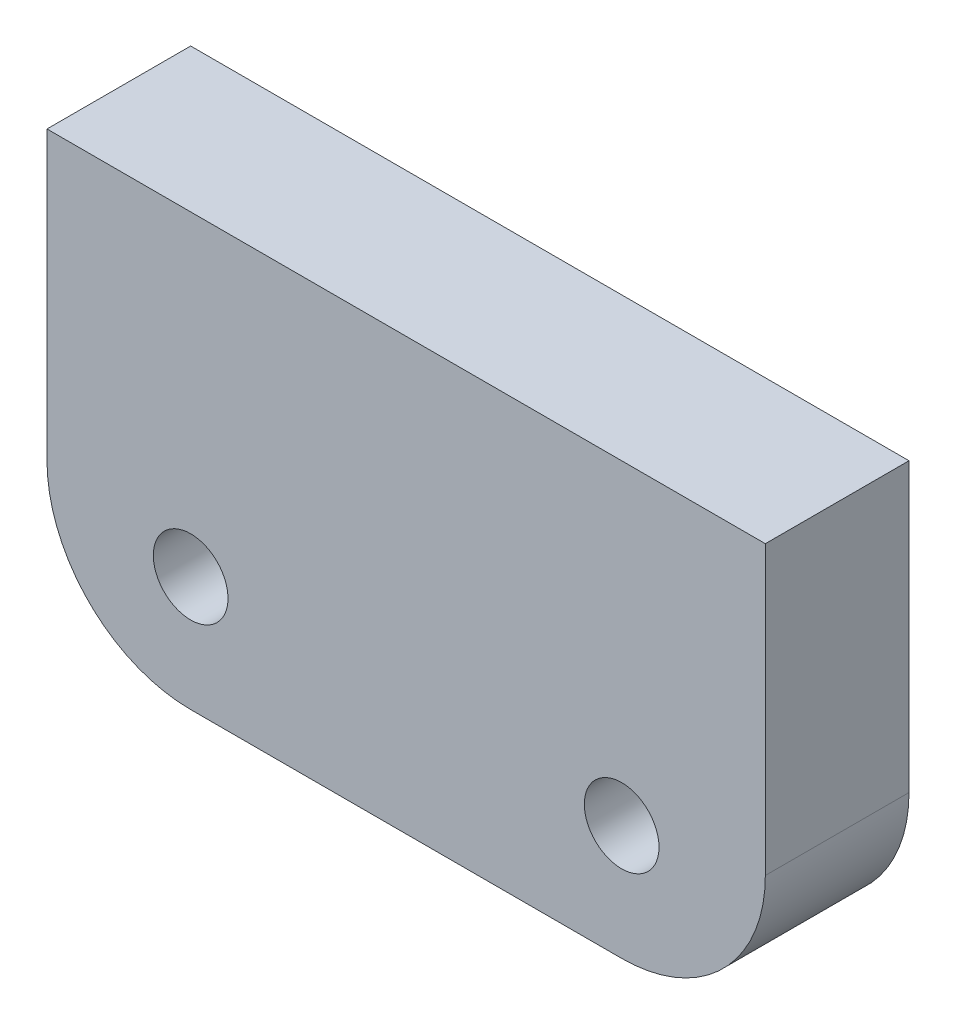
ISO-10303-21;
HEADER;
FILE_DESCRIPTION(('STEP AP214'),'2;1');
FILE_NAME('part.step','',(''),(''),'','','');
FILE_SCHEMA(('AUTOMOTIVE_DESIGN { 1 0 10303 214 1 1 1 1 }'));
ENDSEC;
DATA;
#1=APPLICATION_CONTEXT('core data for automotive mechanical design processes');
#2=APPLICATION_PROTOCOL_DEFINITION('international standard','automotive_design',2000,#1);
#3=PRODUCT_CONTEXT('',#1,'mechanical');
#4=PRODUCT('Part','Part','',(#3));
#5=PRODUCT_RELATED_PRODUCT_CATEGORY('part','',(#4));
#6=PRODUCT_DEFINITION_FORMATION('','',#4);
#7=PRODUCT_DEFINITION_CONTEXT('part definition',#1,'design');
#8=PRODUCT_DEFINITION('design','',#6,#7);
#9=PRODUCT_DEFINITION_SHAPE('','',#8);
#10=(LENGTH_UNIT() NAMED_UNIT(*) SI_UNIT(.MILLI.,.METRE.));
#11=(NAMED_UNIT(*) PLANE_ANGLE_UNIT() SI_UNIT($,.RADIAN.));
#12=(NAMED_UNIT(*) SI_UNIT($,.STERADIAN.) SOLID_ANGLE_UNIT());
#13=UNCERTAINTY_MEASURE_WITH_UNIT(LENGTH_MEASURE(1.E-05),#10,'distance_accuracy_value','');
#14=(GEOMETRIC_REPRESENTATION_CONTEXT(3) GLOBAL_UNCERTAINTY_ASSIGNED_CONTEXT((#13)) GLOBAL_UNIT_ASSIGNED_CONTEXT((#10,
#11,#12)) REPRESENTATION_CONTEXT('',''));
#15=CARTESIAN_POINT('',(0.,0.,0.));
#16=DIRECTION('',(0.,0.,1.));
#17=DIRECTION('',(1.,0.,0.));
#18=AXIS2_PLACEMENT_3D('',#15,#16,#17);
#19=CARTESIAN_POINT('',(-25.,449.949674922525,10.));
#20=DIRECTION('',(1.,0.,0.));
#21=DIRECTION('',(0.,1.,0.));
#22=AXIS2_PLACEMENT_3D('',#19,#20,#21);
#23=PLANE('',#22);
#24=DIRECTION('',(0.,-1.,0.));
#25=VECTOR('',#24,1.);
#26=CARTESIAN_POINT('',(-25.,449.949674922525,0.));
#27=LINE('',#26,#25);
#28=CARTESIAN_POINT('',(-25.,449.949674922525,0.));
#29=VERTEX_POINT('',#28);
#30=CARTESIAN_POINT('',(-25.,429.949674922525,0.));
#31=VERTEX_POINT('',#30);
#32=EDGE_CURVE('E216',#29,#31,#27,.T.);
#33=ORIENTED_EDGE('',*,*,#32,.T.);
#34=DIRECTION('',(0.,0.,-1.));
#35=VECTOR('',#34,1.);
#36=CARTESIAN_POINT('',(-25.,429.949674922525,10.));
#37=LINE('',#36,#35);
#38=CARTESIAN_POINT('',(-25.,429.949674922525,10.));
#39=VERTEX_POINT('',#38);
#40=EDGE_CURVE('E56',#31,#39,#37,.F.);
#41=ORIENTED_EDGE('',*,*,#40,.T.);
#42=DIRECTION('',(0.,-1.,0.));
#43=VECTOR('',#42,1.);
#44=CARTESIAN_POINT('',(-25.,449.949674922525,10.));
#45=LINE('',#44,#43);
#46=CARTESIAN_POINT('',(-25.,449.949674922525,10.));
#47=VERTEX_POINT('',#46);
#48=EDGE_CURVE('E272',#47,#39,#45,.T.);
#49=ORIENTED_EDGE('',*,*,#48,.F.);
#50=DIRECTION('',(0.,0.,-1.));
#51=VECTOR('',#50,1.);
#52=CARTESIAN_POINT('',(-25.,449.949674922525,10.));
#53=LINE('',#52,#51);
#54=EDGE_CURVE('E281',#47,#29,#53,.T.);
#55=ORIENTED_EDGE('',*,*,#54,.T.);
#56=EDGE_LOOP('',(#33,#41,#49,#55));
#57=FACE_BOUND('',#56,.T.);
#58=ADVANCED_FACE('F33',(#57),#23,.F.);
#59=CARTESIAN_POINT('',(-25.,419.949674922525,10.));
#60=DIRECTION('',(0.,1.,0.));
#61=DIRECTION('',(0.,0.,1.));
#62=AXIS2_PLACEMENT_3D('',#59,#60,#61);
#63=PLANE('',#62);
#64=DIRECTION('',(1.,0.,0.));
#65=VECTOR('',#64,1.);
#66=CARTESIAN_POINT('',(-25.,419.949674922525,10.));
#67=LINE('',#66,#65);
#68=CARTESIAN_POINT('',(-15.,419.949674922525,10.));
#69=VERTEX_POINT('',#68);
#70=CARTESIAN_POINT('',(15.,419.949674922525,10.));
#71=VERTEX_POINT('',#70);
#72=EDGE_CURVE('E274',#69,#71,#67,.T.);
#73=ORIENTED_EDGE('',*,*,#72,.F.);
#74=DIRECTION('',(0.,0.,-1.));
#75=VECTOR('',#74,1.);
#76=CARTESIAN_POINT('',(-15.,419.949674922525,10.));
#77=LINE('',#76,#75);
#78=CARTESIAN_POINT('',(-15.,419.949674922525,0.));
#79=VERTEX_POINT('',#78);
#80=EDGE_CURVE('E296',#69,#79,#77,.T.);
#81=ORIENTED_EDGE('',*,*,#80,.T.);
#82=DIRECTION('',(1.,0.,0.));
#83=VECTOR('',#82,1.);
#84=CARTESIAN_POINT('',(-25.,419.949674922525,0.));
#85=LINE('',#84,#83);
#86=CARTESIAN_POINT('',(15.,419.949674922525,0.));
#87=VERTEX_POINT('',#86);
#88=EDGE_CURVE('E283',#79,#87,#85,.T.);
#89=ORIENTED_EDGE('',*,*,#88,.T.);
#90=DIRECTION('',(0.,0.,-1.));
#91=VECTOR('',#90,1.);
#92=CARTESIAN_POINT('',(15.,419.949674922525,10.));
#93=LINE('',#92,#91);
#94=EDGE_CURVE('E294',#87,#71,#93,.F.);
#95=ORIENTED_EDGE('',*,*,#94,.T.);
#96=EDGE_LOOP('',(#73,#81,#89,#95));
#97=FACE_BOUND('',#96,.T.);
#98=ADVANCED_FACE('F310',(#97),#63,.F.);
#99=CARTESIAN_POINT('',(25.,449.949674922525,10.));
#100=DIRECTION('',(-1.,0.,0.));
#101=DIRECTION('',(0.,-1.,0.));
#102=AXIS2_PLACEMENT_3D('',#99,#100,#101);
#103=PLANE('',#102);
#104=DIRECTION('',(0.,1.,0.));
#105=VECTOR('',#104,1.);
#106=CARTESIAN_POINT('',(25.,449.949674922525,10.));
#107=LINE('',#106,#105);
#108=CARTESIAN_POINT('',(25.,429.949674922525,10.));
#109=VERTEX_POINT('',#108);
#110=CARTESIAN_POINT('',(25.,449.949674922525,10.));
#111=VERTEX_POINT('',#110);
#112=EDGE_CURVE('E277',#109,#111,#107,.T.);
#113=ORIENTED_EDGE('',*,*,#112,.F.);
#114=DIRECTION('',(0.,0.,-1.));
#115=VECTOR('',#114,1.);
#116=CARTESIAN_POINT('',(25.,429.949674922525,10.));
#117=LINE('',#116,#115);
#118=CARTESIAN_POINT('',(25.,429.949674922525,0.));
#119=VERTEX_POINT('',#118);
#120=EDGE_CURVE('E11',#109,#119,#117,.T.);
#121=ORIENTED_EDGE('',*,*,#120,.T.);
#122=DIRECTION('',(0.,1.,0.));
#123=VECTOR('',#122,1.);
#124=CARTESIAN_POINT('',(25.,449.949674922525,0.));
#125=LINE('',#124,#123);
#126=CARTESIAN_POINT('',(25.,449.949674922525,0.));
#127=VERTEX_POINT('',#126);
#128=EDGE_CURVE('E286',#119,#127,#125,.T.);
#129=ORIENTED_EDGE('',*,*,#128,.T.);
#130=DIRECTION('',(0.,0.,-1.));
#131=VECTOR('',#130,1.);
#132=CARTESIAN_POINT('',(25.,449.949674922525,10.));
#133=LINE('',#132,#131);
#134=EDGE_CURVE('E291',#111,#127,#133,.T.);
#135=ORIENTED_EDGE('',*,*,#134,.F.);
#136=EDGE_LOOP('',(#113,#121,#129,#135));
#137=FACE_BOUND('',#136,.T.);
#138=ADVANCED_FACE('F325',(#137),#103,.F.);
#139=CARTESIAN_POINT('',(-25.,449.949674922525,10.));
#140=DIRECTION('',(0.,-1.,0.));
#141=DIRECTION('',(0.,0.,-1.));
#142=AXIS2_PLACEMENT_3D('',#139,#140,#141);
#143=PLANE('',#142);
#144=DIRECTION('',(-1.,0.,0.));
#145=VECTOR('',#144,1.);
#146=CARTESIAN_POINT('',(-25.,449.949674922525,0.));
#147=LINE('',#146,#145);
#148=EDGE_CURVE('E275',#127,#29,#147,.T.);
#149=ORIENTED_EDGE('',*,*,#148,.T.);
#150=ORIENTED_EDGE('',*,*,#54,.F.);
#151=DIRECTION('',(-1.,0.,0.));
#152=VECTOR('',#151,1.);
#153=CARTESIAN_POINT('',(-25.,449.949674922525,10.));
#154=LINE('',#153,#152);
#155=EDGE_CURVE('E279',#111,#47,#154,.T.);
#156=ORIENTED_EDGE('',*,*,#155,.F.);
#157=ORIENTED_EDGE('',*,*,#134,.T.);
#158=EDGE_LOOP('',(#149,#150,#156,#157));
#159=FACE_BOUND('',#158,.T.);
#160=ADVANCED_FACE('F321',(#159),#143,.F.);
#161=CARTESIAN_POINT('',(0.,0.,10.));
#162=DIRECTION('',(0.,0.,1.));
#163=DIRECTION('',(1.,0.,0.));
#164=AXIS2_PLACEMENT_3D('',#161,#162,#163);
#165=PLANE('',#164);
#166=CARTESIAN_POINT('',(-15.,427.949674922525,10.));
#167=DIRECTION('',(0.,0.,-1.));
#168=DIRECTION('',(-1.,0.,0.));
#169=AXIS2_PLACEMENT_3D('',#166,#167,#168);
#170=CIRCLE('',#169,2.6);
#171=CARTESIAN_POINT('',(-17.6,427.949674922525,10.));
#172=VERTEX_POINT('',#171);
#173=EDGE_CURVE('E247',#172,#172,#170,.T.);
#174=ORIENTED_EDGE('',*,*,#173,.T.);
#175=EDGE_LOOP('',(#174));
#176=FACE_BOUND('',#175,.T.);
#177=CARTESIAN_POINT('',(15.,427.949674922525,10.));
#178=DIRECTION('',(0.,0.,-1.));
#179=DIRECTION('',(1.,0.,0.));
#180=AXIS2_PLACEMENT_3D('',#177,#178,#179);
#181=CIRCLE('',#180,2.6);
#182=CARTESIAN_POINT('',(17.6,427.949674922525,10.));
#183=VERTEX_POINT('',#182);
#184=EDGE_CURVE('E415',#183,#183,#181,.T.);
#185=ORIENTED_EDGE('',*,*,#184,.T.);
#186=EDGE_LOOP('',(#185));
#187=FACE_BOUND('',#186,.T.);
#188=ORIENTED_EDGE('',*,*,#48,.T.);
#189=CARTESIAN_POINT('',(-15.,429.949674922525,10.));
#190=DIRECTION('',(0.,0.,1.));
#191=DIRECTION('',(1.,0.,0.));
#192=AXIS2_PLACEMENT_3D('',#189,#190,#191);
#193=CIRCLE('',#192,10.);
#194=EDGE_CURVE('E41',#39,#69,#193,.T.);
#195=ORIENTED_EDGE('',*,*,#194,.T.);
#196=ORIENTED_EDGE('',*,*,#72,.T.);
#197=CARTESIAN_POINT('',(15.,429.949674922525,10.));
#198=DIRECTION('',(0.,0.,1.));
#199=DIRECTION('',(1.,0.,0.));
#200=AXIS2_PLACEMENT_3D('',#197,#198,#199);
#201=CIRCLE('',#200,10.);
#202=EDGE_CURVE('E48',#71,#109,#201,.T.);
#203=ORIENTED_EDGE('',*,*,#202,.T.);
#204=ORIENTED_EDGE('',*,*,#112,.T.);
#205=ORIENTED_EDGE('',*,*,#155,.T.);
#206=EDGE_LOOP('',(#188,#195,#196,#203,#204,#205));
#207=FACE_BOUND('',#206,.T.);
#208=ADVANCED_FACE('F306',(#176,#187,#207),#165,.T.);
#209=CARTESIAN_POINT('',(0.,0.,0.));
#210=DIRECTION('',(0.,0.,1.));
#211=DIRECTION('',(1.,0.,0.));
#212=AXIS2_PLACEMENT_3D('',#209,#210,#211);
#213=PLANE('',#212);
#214=DIRECTION('',(0.866025403784437,-0.500000000000003,0.));
#215=VECTOR('',#214,1.);
#216=CARTESIAN_POINT('',(15.,432.568477076042,0.));
#217=LINE('',#216,#215);
#218=CARTESIAN_POINT('',(15.,432.568477076042,0.));
#219=VERTEX_POINT('',#218);
#220=CARTESIAN_POINT('',(19.,430.259075999284,0.));
#221=VERTEX_POINT('',#220);
#222=EDGE_CURVE('E203',#219,#221,#217,.T.);
#223=ORIENTED_EDGE('',*,*,#222,.F.);
#224=DIRECTION('',(0.86602540378444,0.499999999999997,0.));
#225=VECTOR('',#224,1.);
#226=CARTESIAN_POINT('',(11.,430.259075999284,0.));
#227=LINE('',#226,#225);
#228=CARTESIAN_POINT('',(11.,430.259075999284,0.));
#229=VERTEX_POINT('',#228);
#230=EDGE_CURVE('E168',#229,#219,#227,.T.);
#231=ORIENTED_EDGE('',*,*,#230,.F.);
#232=DIRECTION('',(0.,1.,0.));
#233=VECTOR('',#232,1.);
#234=CARTESIAN_POINT('',(11.,425.640273845767,0.));
#235=LINE('',#234,#233);
#236=CARTESIAN_POINT('',(11.,425.640273845767,0.));
#237=VERTEX_POINT('',#236);
#238=EDGE_CURVE('E186',#237,#229,#235,.T.);
#239=ORIENTED_EDGE('',*,*,#238,.F.);
#240=DIRECTION('',(-0.866025403784438,0.500000000000002,0.));
#241=VECTOR('',#240,1.);
#242=CARTESIAN_POINT('',(15.,423.330872769008,0.));
#243=LINE('',#242,#241);
#244=CARTESIAN_POINT('',(15.,423.330872769008,0.));
#245=VERTEX_POINT('',#244);
#246=EDGE_CURVE('E189',#245,#237,#243,.T.);
#247=ORIENTED_EDGE('',*,*,#246,.F.);
#248=DIRECTION('',(-0.866025403784439,-0.499999999999999,0.));
#249=VECTOR('',#248,1.);
#250=CARTESIAN_POINT('',(19.,425.640273845767,0.));
#251=LINE('',#250,#249);
#252=CARTESIAN_POINT('',(19.,425.640273845767,0.));
#253=VERTEX_POINT('',#252);
#254=EDGE_CURVE('E209',#253,#245,#251,.T.);
#255=ORIENTED_EDGE('',*,*,#254,.F.);
#256=DIRECTION('',(0.,-1.,0.));
#257=VECTOR('',#256,1.);
#258=CARTESIAN_POINT('',(19.,430.259075999284,0.));
#259=LINE('',#258,#257);
#260=EDGE_CURVE('E206',#221,#253,#259,.T.);
#261=ORIENTED_EDGE('',*,*,#260,.F.);
#262=EDGE_LOOP('',(#223,#231,#239,#247,#255,#261));
#263=FACE_BOUND('',#262,.T.);
#264=DIRECTION('',(-0.866025403784438,-0.500000000000002,0.));
#265=VECTOR('',#264,1.);
#266=CARTESIAN_POINT('',(-15.,423.330872769008,0.));
#267=LINE('',#266,#265);
#268=CARTESIAN_POINT('',(-11.,425.640273845767,0.));
#269=VERTEX_POINT('',#268);
#270=CARTESIAN_POINT('',(-15.,423.330872769008,0.));
#271=VERTEX_POINT('',#270);
#272=EDGE_CURVE('E246',#269,#271,#267,.T.);
#273=ORIENTED_EDGE('',*,*,#272,.F.);
#274=DIRECTION('',(0.,-1.,0.));
#275=VECTOR('',#274,1.);
#276=CARTESIAN_POINT('',(-11.,425.640273845767,0.));
#277=LINE('',#276,#275);
#278=CARTESIAN_POINT('',(-11.,430.259075999284,0.));
#279=VERTEX_POINT('',#278);
#280=EDGE_CURVE('E244',#279,#269,#277,.T.);
#281=ORIENTED_EDGE('',*,*,#280,.F.);
#282=DIRECTION('',(0.86602540378444,-0.499999999999997,0.));
#283=VECTOR('',#282,1.);
#284=CARTESIAN_POINT('',(-11.,430.259075999284,0.));
#285=LINE('',#284,#283);
#286=CARTESIAN_POINT('',(-15.,432.568477076042,0.));
#287=VERTEX_POINT('',#286);
#288=EDGE_CURVE('E228',#287,#279,#285,.T.);
#289=ORIENTED_EDGE('',*,*,#288,.F.);
#290=DIRECTION('',(0.866025403784437,0.500000000000004,0.));
#291=VECTOR('',#290,1.);
#292=CARTESIAN_POINT('',(-15.,432.568477076042,0.));
#293=LINE('',#292,#291);
#294=CARTESIAN_POINT('',(-19.,430.259075999284,0.));
#295=VERTEX_POINT('',#294);
#296=EDGE_CURVE('E256',#295,#287,#293,.T.);
#297=ORIENTED_EDGE('',*,*,#296,.F.);
#298=DIRECTION('',(0.,1.,0.));
#299=VECTOR('',#298,1.);
#300=CARTESIAN_POINT('',(-19.,430.259075999284,0.));
#301=LINE('',#300,#299);
#302=CARTESIAN_POINT('',(-19.,425.640273845767,0.));
#303=VERTEX_POINT('',#302);
#304=EDGE_CURVE('E253',#303,#295,#301,.T.);
#305=ORIENTED_EDGE('',*,*,#304,.F.);
#306=DIRECTION('',(-0.866025403784439,0.499999999999999,0.));
#307=VECTOR('',#306,1.);
#308=CARTESIAN_POINT('',(-19.,425.640273845767,0.));
#309=LINE('',#308,#307);
#310=EDGE_CURVE('E250',#271,#303,#309,.T.);
#311=ORIENTED_EDGE('',*,*,#310,.F.);
#312=EDGE_LOOP('',(#273,#281,#289,#297,#305,#311));
#313=FACE_BOUND('',#312,.T.);
#314=ORIENTED_EDGE('',*,*,#88,.F.);
#315=CARTESIAN_POINT('',(-15.,429.949674922525,0.));
#316=DIRECTION('',(0.,0.,1.));
#317=DIRECTION('',(1.,0.,0.));
#318=AXIS2_PLACEMENT_3D('',#315,#316,#317);
#319=CIRCLE('',#318,10.);
#320=EDGE_CURVE('E301',#79,#31,#319,.F.);
#321=ORIENTED_EDGE('',*,*,#320,.T.);
#322=ORIENTED_EDGE('',*,*,#32,.F.);
#323=ORIENTED_EDGE('',*,*,#148,.F.);
#324=ORIENTED_EDGE('',*,*,#128,.F.);
#325=CARTESIAN_POINT('',(15.,429.949674922525,0.));
#326=DIRECTION('',(0.,0.,1.));
#327=DIRECTION('',(1.,0.,0.));
#328=AXIS2_PLACEMENT_3D('',#325,#326,#327);
#329=CIRCLE('',#328,10.);
#330=EDGE_CURVE('E299',#119,#87,#329,.F.);
#331=ORIENTED_EDGE('',*,*,#330,.T.);
#332=EDGE_LOOP('',(#314,#321,#322,#323,#324,#331));
#333=FACE_BOUND('',#332,.T.);
#334=ADVANCED_FACE('F316',(#263,#313,#333),#213,.F.);
#335=CARTESIAN_POINT('',(-11.,425.640273845767,5.));
#336=DIRECTION('',(1.,0.,0.));
#337=DIRECTION('',(0.,1.,0.));
#338=AXIS2_PLACEMENT_3D('',#335,#336,#337);
#339=PLANE('',#338);
#340=ORIENTED_EDGE('',*,*,#280,.T.);
#341=DIRECTION('',(0.,0.,-1.));
#342=VECTOR('',#341,1.);
#343=CARTESIAN_POINT('',(-11.,425.640273845767,5.));
#344=LINE('',#343,#342);
#345=CARTESIAN_POINT('',(-11.,425.640273845767,5.));
#346=VERTEX_POINT('',#345);
#347=EDGE_CURVE('E243',#346,#269,#344,.T.);
#348=ORIENTED_EDGE('',*,*,#347,.F.);
#349=DIRECTION('',(0.,-1.,0.));
#350=VECTOR('',#349,1.);
#351=CARTESIAN_POINT('',(-11.,425.640273845767,5.));
#352=LINE('',#351,#350);
#353=CARTESIAN_POINT('',(-11.,430.259075999284,5.));
#354=VERTEX_POINT('',#353);
#355=EDGE_CURVE('E224',#354,#346,#352,.T.);
#356=ORIENTED_EDGE('',*,*,#355,.F.);
#357=DIRECTION('',(0.,0.,-1.));
#358=VECTOR('',#357,1.);
#359=CARTESIAN_POINT('',(-11.,430.259075999284,5.));
#360=LINE('',#359,#358);
#361=EDGE_CURVE('E204',#354,#279,#360,.T.);
#362=ORIENTED_EDGE('',*,*,#361,.T.);
#363=EDGE_LOOP('',(#340,#348,#356,#362));
#364=FACE_BOUND('',#363,.T.);
#365=ADVANCED_FACE('F346',(#364),#339,.F.);
#366=CARTESIAN_POINT('',(-11.,430.259075999284,5.));
#367=DIRECTION('',(0.499999999999997,0.86602540378444,0.));
#368=DIRECTION('',(-0.86602540378444,0.499999999999997,0.));
#369=AXIS2_PLACEMENT_3D('',#366,#367,#368);
#370=PLANE('',#369);
#371=ORIENTED_EDGE('',*,*,#288,.T.);
#372=ORIENTED_EDGE('',*,*,#361,.F.);
#373=DIRECTION('',(0.86602540378444,-0.499999999999997,0.));
#374=VECTOR('',#373,1.);
#375=CARTESIAN_POINT('',(-11.,430.259075999284,5.));
#376=LINE('',#375,#374);
#377=CARTESIAN_POINT('',(-15.,432.568477076042,5.));
#378=VERTEX_POINT('',#377);
#379=EDGE_CURVE('E240',#378,#354,#376,.T.);
#380=ORIENTED_EDGE('',*,*,#379,.F.);
#381=DIRECTION('',(0.,0.,-1.));
#382=VECTOR('',#381,1.);
#383=CARTESIAN_POINT('',(-15.,432.568477076042,5.));
#384=LINE('',#383,#382);
#385=EDGE_CURVE('E262',#378,#287,#384,.T.);
#386=ORIENTED_EDGE('',*,*,#385,.T.);
#387=EDGE_LOOP('',(#371,#372,#380,#386));
#388=FACE_BOUND('',#387,.T.);
#389=ADVANCED_FACE('F353',(#388),#370,.F.);
#390=CARTESIAN_POINT('',(-15.,432.568477076042,5.));
#391=DIRECTION('',(-0.500000000000004,0.866025403784437,0.));
#392=DIRECTION('',(-0.866025403784437,-0.500000000000004,0.));
#393=AXIS2_PLACEMENT_3D('',#390,#391,#392);
#394=PLANE('',#393);
#395=ORIENTED_EDGE('',*,*,#296,.T.);
#396=ORIENTED_EDGE('',*,*,#385,.F.);
#397=DIRECTION('',(0.866025403784437,0.500000000000004,0.));
#398=VECTOR('',#397,1.);
#399=CARTESIAN_POINT('',(-15.,432.568477076042,5.));
#400=LINE('',#399,#398);
#401=CARTESIAN_POINT('',(-19.,430.259075999284,5.));
#402=VERTEX_POINT('',#401);
#403=EDGE_CURVE('E237',#402,#378,#400,.T.);
#404=ORIENTED_EDGE('',*,*,#403,.F.);
#405=DIRECTION('',(0.,0.,-1.));
#406=VECTOR('',#405,1.);
#407=CARTESIAN_POINT('',(-19.,430.259075999284,5.));
#408=LINE('',#407,#406);
#409=EDGE_CURVE('E264',#402,#295,#408,.T.);
#410=ORIENTED_EDGE('',*,*,#409,.T.);
#411=EDGE_LOOP('',(#395,#396,#404,#410));
#412=FACE_BOUND('',#411,.T.);
#413=ADVANCED_FACE('F367',(#412),#394,.F.);
#414=CARTESIAN_POINT('',(-19.,430.259075999284,5.));
#415=DIRECTION('',(-1.,0.,0.));
#416=DIRECTION('',(0.,0.,1.));
#417=AXIS2_PLACEMENT_3D('',#414,#415,#416);
#418=PLANE('',#417);
#419=ORIENTED_EDGE('',*,*,#304,.T.);
#420=ORIENTED_EDGE('',*,*,#409,.F.);
#421=DIRECTION('',(0.,1.,0.));
#422=VECTOR('',#421,1.);
#423=CARTESIAN_POINT('',(-19.,430.259075999284,5.));
#424=LINE('',#423,#422);
#425=CARTESIAN_POINT('',(-19.,425.640273845767,5.));
#426=VERTEX_POINT('',#425);
#427=EDGE_CURVE('E234',#426,#402,#424,.T.);
#428=ORIENTED_EDGE('',*,*,#427,.F.);
#429=DIRECTION('',(0.,0.,-1.));
#430=VECTOR('',#429,1.);
#431=CARTESIAN_POINT('',(-19.,425.640273845767,5.));
#432=LINE('',#431,#430);
#433=EDGE_CURVE('E266',#426,#303,#432,.T.);
#434=ORIENTED_EDGE('',*,*,#433,.T.);
#435=EDGE_LOOP('',(#419,#420,#428,#434));
#436=FACE_BOUND('',#435,.T.);
#437=ADVANCED_FACE('F363',(#436),#418,.F.);
#438=CARTESIAN_POINT('',(-19.,425.640273845767,5.));
#439=DIRECTION('',(-0.499999999999999,-0.866025403784439,0.));
#440=DIRECTION('',(0.866025403784439,-0.499999999999999,0.));
#441=AXIS2_PLACEMENT_3D('',#438,#439,#440);
#442=PLANE('',#441);
#443=ORIENTED_EDGE('',*,*,#310,.T.);
#444=ORIENTED_EDGE('',*,*,#433,.F.);
#445=DIRECTION('',(-0.866025403784439,0.499999999999999,0.));
#446=VECTOR('',#445,1.);
#447=CARTESIAN_POINT('',(-19.,425.640273845767,5.));
#448=LINE('',#447,#446);
#449=CARTESIAN_POINT('',(-15.,423.330872769008,5.));
#450=VERTEX_POINT('',#449);
#451=EDGE_CURVE('E231',#450,#426,#448,.T.);
#452=ORIENTED_EDGE('',*,*,#451,.F.);
#453=DIRECTION('',(0.,0.,-1.));
#454=VECTOR('',#453,1.);
#455=CARTESIAN_POINT('',(-15.,423.330872769008,5.));
#456=LINE('',#455,#454);
#457=EDGE_CURVE('E268',#450,#271,#456,.T.);
#458=ORIENTED_EDGE('',*,*,#457,.T.);
#459=EDGE_LOOP('',(#443,#444,#452,#458));
#460=FACE_BOUND('',#459,.T.);
#461=ADVANCED_FACE('F359',(#460),#442,.F.);
#462=CARTESIAN_POINT('',(-15.,423.330872769008,5.));
#463=DIRECTION('',(0.500000000000002,-0.866025403784438,0.));
#464=DIRECTION('',(0.866025403784438,0.500000000000002,0.));
#465=AXIS2_PLACEMENT_3D('',#462,#463,#464);
#466=PLANE('',#465);
#467=ORIENTED_EDGE('',*,*,#272,.T.);
#468=ORIENTED_EDGE('',*,*,#457,.F.);
#469=DIRECTION('',(-0.866025403784438,-0.500000000000002,0.));
#470=VECTOR('',#469,1.);
#471=CARTESIAN_POINT('',(-15.,423.330872769008,5.));
#472=LINE('',#471,#470);
#473=EDGE_CURVE('E227',#346,#450,#472,.T.);
#474=ORIENTED_EDGE('',*,*,#473,.F.);
#475=ORIENTED_EDGE('',*,*,#347,.T.);
#476=EDGE_LOOP('',(#467,#468,#474,#475));
#477=FACE_BOUND('',#476,.T.);
#478=ADVANCED_FACE('F355',(#477),#466,.F.);
#479=CARTESIAN_POINT('',(0.,0.,5.));
#480=DIRECTION('',(0.,0.,1.));
#481=DIRECTION('',(1.,0.,0.));
#482=AXIS2_PLACEMENT_3D('',#479,#480,#481);
#483=PLANE('',#482);
#484=CARTESIAN_POINT('',(-15.,427.949674922525,5.));
#485=DIRECTION('',(0.,0.,-1.));
#486=DIRECTION('',(-1.,0.,0.));
#487=AXIS2_PLACEMENT_3D('',#484,#485,#486);
#488=CIRCLE('',#487,2.6);
#489=CARTESIAN_POINT('',(-17.6,427.949674922525,5.));
#490=VERTEX_POINT('',#489);
#491=EDGE_CURVE('E414',#490,#490,#488,.T.);
#492=ORIENTED_EDGE('',*,*,#491,.F.);
#493=EDGE_LOOP('',(#492));
#494=FACE_BOUND('',#493,.T.);
#495=ORIENTED_EDGE('',*,*,#355,.T.);
#496=ORIENTED_EDGE('',*,*,#473,.T.);
#497=ORIENTED_EDGE('',*,*,#451,.T.);
#498=ORIENTED_EDGE('',*,*,#427,.T.);
#499=ORIENTED_EDGE('',*,*,#403,.T.);
#500=ORIENTED_EDGE('',*,*,#379,.T.);
#501=EDGE_LOOP('',(#495,#496,#497,#498,#499,#500));
#502=FACE_BOUND('',#501,.T.);
#503=ADVANCED_FACE('F358',(#494,#502),#483,.F.);
#504=CARTESIAN_POINT('',(11.,430.259075999284,5.));
#505=DIRECTION('',(-0.499999999999997,0.86602540378444,0.));
#506=DIRECTION('',(-0.86602540378444,-0.499999999999997,0.));
#507=AXIS2_PLACEMENT_3D('',#504,#505,#506);
#508=PLANE('',#507);
#509=ORIENTED_EDGE('',*,*,#230,.T.);
#510=DIRECTION('',(0.,0.,-1.));
#511=VECTOR('',#510,1.);
#512=CARTESIAN_POINT('',(15.,432.568477076042,5.));
#513=LINE('',#512,#511);
#514=CARTESIAN_POINT('',(15.,432.568477076042,5.));
#515=VERTEX_POINT('',#514);
#516=EDGE_CURVE('E161',#515,#219,#513,.T.);
#517=ORIENTED_EDGE('',*,*,#516,.F.);
#518=DIRECTION('',(0.86602540378444,0.499999999999997,0.));
#519=VECTOR('',#518,1.);
#520=CARTESIAN_POINT('',(11.,430.259075999284,5.));
#521=LINE('',#520,#519);
#522=CARTESIAN_POINT('',(11.,430.259075999284,5.));
#523=VERTEX_POINT('',#522);
#524=EDGE_CURVE('E165',#523,#515,#521,.T.);
#525=ORIENTED_EDGE('',*,*,#524,.F.);
#526=DIRECTION('',(0.,0.,-1.));
#527=VECTOR('',#526,1.);
#528=CARTESIAN_POINT('',(11.,430.259075999284,5.));
#529=LINE('',#528,#527);
#530=EDGE_CURVE('E214',#523,#229,#529,.T.);
#531=ORIENTED_EDGE('',*,*,#530,.T.);
#532=EDGE_LOOP('',(#509,#517,#525,#531));
#533=FACE_BOUND('',#532,.T.);
#534=ADVANCED_FACE('F163',(#533),#508,.F.);
#535=CARTESIAN_POINT('',(11.,425.640273845767,5.));
#536=DIRECTION('',(-1.,0.,0.));
#537=DIRECTION('',(0.,0.,1.));
#538=AXIS2_PLACEMENT_3D('',#535,#536,#537);
#539=PLANE('',#538);
#540=ORIENTED_EDGE('',*,*,#238,.T.);
#541=ORIENTED_EDGE('',*,*,#530,.F.);
#542=DIRECTION('',(0.,1.,0.));
#543=VECTOR('',#542,1.);
#544=CARTESIAN_POINT('',(11.,425.640273845767,5.));
#545=LINE('',#544,#543);
#546=CARTESIAN_POINT('',(11.,425.640273845767,5.));
#547=VERTEX_POINT('',#546);
#548=EDGE_CURVE('E173',#547,#523,#545,.T.);
#549=ORIENTED_EDGE('',*,*,#548,.F.);
#550=DIRECTION('',(0.,0.,-1.));
#551=VECTOR('',#550,1.);
#552=CARTESIAN_POINT('',(11.,425.640273845767,5.));
#553=LINE('',#552,#551);
#554=EDGE_CURVE('E217',#547,#237,#553,.T.);
#555=ORIENTED_EDGE('',*,*,#554,.T.);
#556=EDGE_LOOP('',(#540,#541,#549,#555));
#557=FACE_BOUND('',#556,.T.);
#558=ADVANCED_FACE('F380',(#557),#539,.F.);
#559=CARTESIAN_POINT('',(15.,423.330872769008,5.));
#560=DIRECTION('',(-0.500000000000002,-0.866025403784438,0.));
#561=DIRECTION('',(0.866025403784438,-0.500000000000002,0.));
#562=AXIS2_PLACEMENT_3D('',#559,#560,#561);
#563=PLANE('',#562);
#564=ORIENTED_EDGE('',*,*,#246,.T.);
#565=ORIENTED_EDGE('',*,*,#554,.F.);
#566=DIRECTION('',(-0.866025403784438,0.500000000000002,0.));
#567=VECTOR('',#566,1.);
#568=CARTESIAN_POINT('',(15.,423.330872769008,5.));
#569=LINE('',#568,#567);
#570=CARTESIAN_POINT('',(15.,423.330872769008,5.));
#571=VERTEX_POINT('',#570);
#572=EDGE_CURVE('E199',#571,#547,#569,.T.);
#573=ORIENTED_EDGE('',*,*,#572,.F.);
#574=DIRECTION('',(0.,0.,-1.));
#575=VECTOR('',#574,1.);
#576=CARTESIAN_POINT('',(15.,423.330872769008,5.));
#577=LINE('',#576,#575);
#578=EDGE_CURVE('E219',#571,#245,#577,.T.);
#579=ORIENTED_EDGE('',*,*,#578,.T.);
#580=EDGE_LOOP('',(#564,#565,#573,#579));
#581=FACE_BOUND('',#580,.T.);
#582=ADVANCED_FACE('F390',(#581),#563,.F.);
#583=CARTESIAN_POINT('',(19.,425.640273845767,5.));
#584=DIRECTION('',(0.499999999999999,-0.866025403784439,0.));
#585=DIRECTION('',(0.866025403784439,0.499999999999999,0.));
#586=AXIS2_PLACEMENT_3D('',#583,#584,#585);
#587=PLANE('',#586);
#588=ORIENTED_EDGE('',*,*,#254,.T.);
#589=ORIENTED_EDGE('',*,*,#578,.F.);
#590=DIRECTION('',(-0.866025403784439,-0.499999999999999,0.));
#591=VECTOR('',#590,1.);
#592=CARTESIAN_POINT('',(19.,425.640273845767,5.));
#593=LINE('',#592,#591);
#594=CARTESIAN_POINT('',(19.,425.640273845767,5.));
#595=VERTEX_POINT('',#594);
#596=EDGE_CURVE('E196',#595,#571,#593,.T.);
#597=ORIENTED_EDGE('',*,*,#596,.F.);
#598=DIRECTION('',(0.,0.,-1.));
#599=VECTOR('',#598,1.);
#600=CARTESIAN_POINT('',(19.,425.640273845767,5.));
#601=LINE('',#600,#599);
#602=EDGE_CURVE('E221',#595,#253,#601,.T.);
#603=ORIENTED_EDGE('',*,*,#602,.T.);
#604=EDGE_LOOP('',(#588,#589,#597,#603));
#605=FACE_BOUND('',#604,.T.);
#606=ADVANCED_FACE('F386',(#605),#587,.F.);
#607=CARTESIAN_POINT('',(19.,430.259075999284,5.));
#608=DIRECTION('',(1.,0.,0.));
#609=DIRECTION('',(0.,0.,-1.));
#610=AXIS2_PLACEMENT_3D('',#607,#608,#609);
#611=PLANE('',#610);
#612=ORIENTED_EDGE('',*,*,#260,.T.);
#613=ORIENTED_EDGE('',*,*,#602,.F.);
#614=DIRECTION('',(0.,-1.,0.));
#615=VECTOR('',#614,1.);
#616=CARTESIAN_POINT('',(19.,430.259075999284,5.));
#617=LINE('',#616,#615);
#618=CARTESIAN_POINT('',(19.,430.259075999284,5.));
#619=VERTEX_POINT('',#618);
#620=EDGE_CURVE('E181',#619,#595,#617,.T.);
#621=ORIENTED_EDGE('',*,*,#620,.F.);
#622=DIRECTION('',(0.,0.,-1.));
#623=VECTOR('',#622,1.);
#624=CARTESIAN_POINT('',(19.,430.259075999284,5.));
#625=LINE('',#624,#623);
#626=EDGE_CURVE('E172',#619,#221,#625,.T.);
#627=ORIENTED_EDGE('',*,*,#626,.T.);
#628=EDGE_LOOP('',(#612,#613,#621,#627));
#629=FACE_BOUND('',#628,.T.);
#630=ADVANCED_FACE('F383',(#629),#611,.F.);
#631=CARTESIAN_POINT('',(15.,432.568477076042,5.));
#632=DIRECTION('',(0.500000000000003,0.866025403784437,0.));
#633=DIRECTION('',(-0.866025403784437,0.500000000000003,0.));
#634=AXIS2_PLACEMENT_3D('',#631,#632,#633);
#635=PLANE('',#634);
#636=ORIENTED_EDGE('',*,*,#222,.T.);
#637=ORIENTED_EDGE('',*,*,#626,.F.);
#638=DIRECTION('',(0.866025403784437,-0.500000000000003,0.));
#639=VECTOR('',#638,1.);
#640=CARTESIAN_POINT('',(15.,432.568477076042,5.));
#641=LINE('',#640,#639);
#642=EDGE_CURVE('E176',#515,#619,#641,.T.);
#643=ORIENTED_EDGE('',*,*,#642,.F.);
#644=ORIENTED_EDGE('',*,*,#516,.T.);
#645=EDGE_LOOP('',(#636,#637,#643,#644));
#646=FACE_BOUND('',#645,.T.);
#647=ADVANCED_FACE('F177',(#646),#635,.F.);
#648=CARTESIAN_POINT('',(0.,0.,5.));
#649=DIRECTION('',(0.,0.,-1.));
#650=DIRECTION('',(-1.,0.,0.));
#651=AXIS2_PLACEMENT_3D('',#648,#649,#650);
#652=PLANE('',#651);
#653=CARTESIAN_POINT('',(15.,427.949674922525,5.));
#654=DIRECTION('',(0.,0.,-1.));
#655=DIRECTION('',(1.,0.,0.));
#656=AXIS2_PLACEMENT_3D('',#653,#654,#655);
#657=CIRCLE('',#656,2.6);
#658=CARTESIAN_POINT('',(17.6,427.949674922525,5.));
#659=VERTEX_POINT('',#658);
#660=EDGE_CURVE('E192',#659,#659,#657,.T.);
#661=ORIENTED_EDGE('',*,*,#660,.F.);
#662=EDGE_LOOP('',(#661));
#663=FACE_BOUND('',#662,.T.);
#664=ORIENTED_EDGE('',*,*,#524,.T.);
#665=ORIENTED_EDGE('',*,*,#642,.T.);
#666=ORIENTED_EDGE('',*,*,#620,.T.);
#667=ORIENTED_EDGE('',*,*,#596,.T.);
#668=ORIENTED_EDGE('',*,*,#572,.T.);
#669=ORIENTED_EDGE('',*,*,#548,.T.);
#670=EDGE_LOOP('',(#664,#665,#666,#667,#668,#669));
#671=FACE_BOUND('',#670,.T.);
#672=ADVANCED_FACE('F183',(#663,#671),#652,.T.);
#673=CARTESIAN_POINT('',(15.,427.949674922525,10.));
#674=DIRECTION('',(0.,0.,-1.));
#675=DIRECTION('',(-1.,0.,0.));
#676=AXIS2_PLACEMENT_3D('',#673,#674,#675);
#677=CYLINDRICAL_SURFACE('',#676,2.6);
#678=ORIENTED_EDGE('',*,*,#184,.F.);
#679=EDGE_LOOP('',(#678));
#680=FACE_BOUND('',#679,.T.);
#681=ORIENTED_EDGE('',*,*,#660,.T.);
#682=EDGE_LOOP('',(#681));
#683=FACE_BOUND('',#682,.T.);
#684=ADVANCED_FACE('F400',(#680,#683),#677,.F.);
#685=CARTESIAN_POINT('',(-15.,427.949674922525,10.));
#686=DIRECTION('',(0.,0.,-1.));
#687=DIRECTION('',(-1.,0.,0.));
#688=AXIS2_PLACEMENT_3D('',#685,#686,#687);
#689=CYLINDRICAL_SURFACE('',#688,2.6);
#690=ORIENTED_EDGE('',*,*,#173,.F.);
#691=EDGE_LOOP('',(#690));
#692=FACE_BOUND('',#691,.T.);
#693=ORIENTED_EDGE('',*,*,#491,.T.);
#694=EDGE_LOOP('',(#693));
#695=FACE_BOUND('',#694,.T.);
#696=ADVANCED_FACE('F332',(#692,#695),#689,.F.);
#697=CARTESIAN_POINT('',(-15.,429.949674922525,10.));
#698=DIRECTION('',(0.,0.,-1.));
#699=DIRECTION('',(-1.,0.,0.));
#700=AXIS2_PLACEMENT_3D('',#697,#698,#699);
#701=CYLINDRICAL_SURFACE('',#700,10.);
#702=ORIENTED_EDGE('',*,*,#194,.F.);
#703=ORIENTED_EDGE('',*,*,#40,.F.);
#704=ORIENTED_EDGE('',*,*,#320,.F.);
#705=ORIENTED_EDGE('',*,*,#80,.F.);
#706=EDGE_LOOP('',(#702,#703,#704,#705));
#707=FACE_BOUND('',#706,.T.);
#708=ADVANCED_FACE('F313',(#707),#701,.T.);
#709=CARTESIAN_POINT('',(15.,429.949674922525,10.));
#710=DIRECTION('',(0.,0.,-1.));
#711=DIRECTION('',(-1.,0.,0.));
#712=AXIS2_PLACEMENT_3D('',#709,#710,#711);
#713=CYLINDRICAL_SURFACE('',#712,10.);
#714=ORIENTED_EDGE('',*,*,#202,.F.);
#715=ORIENTED_EDGE('',*,*,#94,.F.);
#716=ORIENTED_EDGE('',*,*,#330,.F.);
#717=ORIENTED_EDGE('',*,*,#120,.F.);
#718=EDGE_LOOP('',(#714,#715,#716,#717));
#719=FACE_BOUND('',#718,.T.);
#720=ADVANCED_FACE('F35',(#719),#713,.T.);
#721=CLOSED_SHELL('',(#58,#98,#138,#160,#208,#334,#365,#389,#413,#437,#461,#478,#503,#534,#558,
#582,#606,#630,#647,#672,#684,#696,#708,#720));
#722=MANIFOLD_SOLID_BREP('B2',#721);
#723=ADVANCED_BREP_SHAPE_REPRESENTATION('',(#18,#722),#14);
#724=SHAPE_DEFINITION_REPRESENTATION(#9,#723);
ENDSEC;
END-ISO-10303-21;
